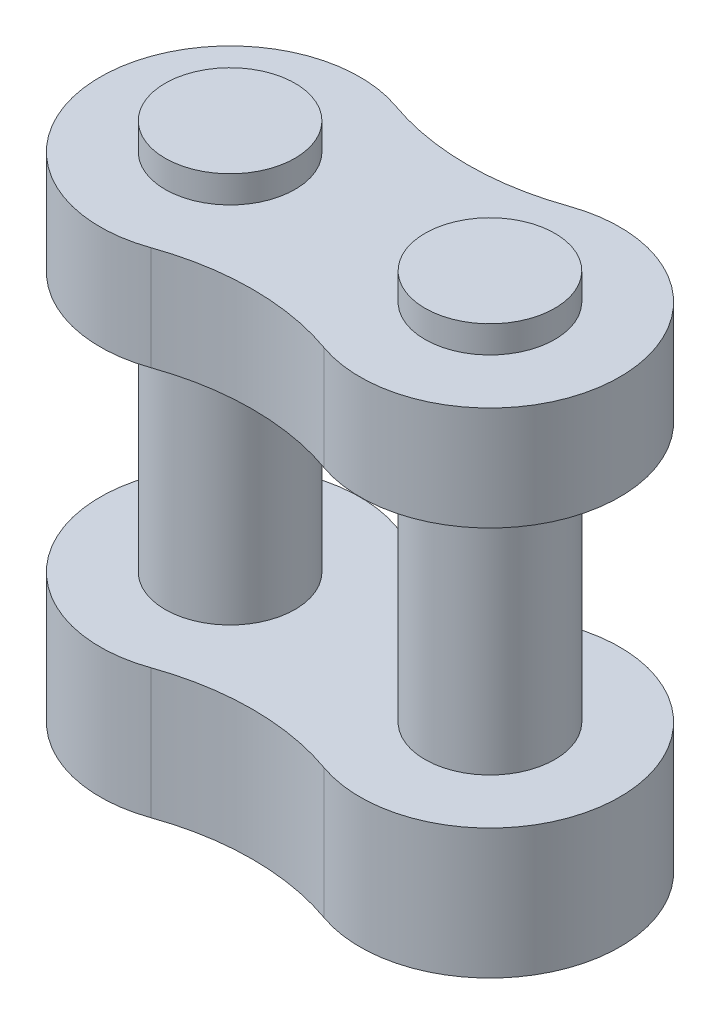
ISO-10303-21;
HEADER;
FILE_DESCRIPTION(('STEP AP214'),'2;1');
FILE_NAME('part.step','',(''),(''),'','','');
FILE_SCHEMA(('AUTOMOTIVE_DESIGN { 1 0 10303 214 1 1 1 1 }'));
ENDSEC;
DATA;
#1=APPLICATION_CONTEXT('core data for automotive mechanical design processes');
#2=APPLICATION_PROTOCOL_DEFINITION('international standard','automotive_design',2000,#1);
#3=PRODUCT_CONTEXT('',#1,'mechanical');
#4=PRODUCT('Part','Part','',(#3));
#5=PRODUCT_RELATED_PRODUCT_CATEGORY('part','',(#4));
#6=PRODUCT_DEFINITION_FORMATION('','',#4);
#7=PRODUCT_DEFINITION_CONTEXT('part definition',#1,'design');
#8=PRODUCT_DEFINITION('design','',#6,#7);
#9=PRODUCT_DEFINITION_SHAPE('','',#8);
#10=(LENGTH_UNIT() NAMED_UNIT(*) SI_UNIT(.MILLI.,.METRE.));
#11=(NAMED_UNIT(*) PLANE_ANGLE_UNIT() SI_UNIT($,.RADIAN.));
#12=(NAMED_UNIT(*) SI_UNIT($,.STERADIAN.) SOLID_ANGLE_UNIT());
#13=UNCERTAINTY_MEASURE_WITH_UNIT(LENGTH_MEASURE(1.E-05),#10,'distance_accuracy_value','');
#14=(GEOMETRIC_REPRESENTATION_CONTEXT(3) GLOBAL_UNCERTAINTY_ASSIGNED_CONTEXT((#13)) GLOBAL_UNIT_ASSIGNED_CONTEXT((#10,
#11,#12)) REPRESENTATION_CONTEXT('',''));
#15=CARTESIAN_POINT('',(0.,0.,0.));
#16=DIRECTION('',(0.,0.,1.));
#17=DIRECTION('',(1.,0.,0.));
#18=AXIS2_PLACEMENT_3D('',#15,#16,#17);
#19=CARTESIAN_POINT('',(-6.35,-9.525,0.));
#20=DIRECTION('',(0.,1.,0.));
#21=DIRECTION('',(0.,0.,1.));
#22=AXIS2_PLACEMENT_3D('',#19,#20,#21);
#23=CYLINDRICAL_SURFACE('',#22,3.175);
#24=CARTESIAN_POINT('',(-6.35,-6.35,0.));
#25=DIRECTION('',(0.,-1.,0.));
#26=DIRECTION('',(0.,0.,-1.));
#27=AXIS2_PLACEMENT_3D('',#24,#25,#26);
#28=CIRCLE('',#27,3.175);
#29=CARTESIAN_POINT('',(-5.29166666666667,-6.35,2.99341870702305));
#30=VERTEX_POINT('',#29);
#31=CARTESIAN_POINT('',(-5.29166666666667,-6.35,-2.99341870702305));
#32=VERTEX_POINT('',#31);
#33=EDGE_CURVE('E130',#30,#32,#28,.T.);
#34=ORIENTED_EDGE('',*,*,#33,.T.);
#35=DIRECTION('',(0.,1.,0.));
#36=VECTOR('',#35,1.);
#37=CARTESIAN_POINT('',(-5.29166666666667,-9.525,-2.99341870702305));
#38=LINE('',#37,#36);
#39=CARTESIAN_POINT('',(-5.29166666666667,-9.525,-2.99341870702305));
#40=VERTEX_POINT('',#39);
#41=EDGE_CURVE('E13',#40,#32,#38,.T.);
#42=ORIENTED_EDGE('',*,*,#41,.F.);
#43=CARTESIAN_POINT('',(-6.35,-9.525,0.));
#44=DIRECTION('',(0.,-1.,0.));
#45=DIRECTION('',(0.,0.,-1.));
#46=AXIS2_PLACEMENT_3D('',#43,#44,#45);
#47=CIRCLE('',#46,3.175);
#48=CARTESIAN_POINT('',(-5.29166666666667,-9.525,2.99341870702305));
#49=VERTEX_POINT('',#48);
#50=EDGE_CURVE('E116',#49,#40,#47,.T.);
#51=ORIENTED_EDGE('',*,*,#50,.F.);
#52=DIRECTION('',(0.,1.,0.));
#53=VECTOR('',#52,1.);
#54=CARTESIAN_POINT('',(-5.29166666666667,-9.525,2.99341870702305));
#55=LINE('',#54,#53);
#56=EDGE_CURVE('E83',#49,#30,#55,.T.);
#57=ORIENTED_EDGE('',*,*,#56,.T.);
#58=EDGE_LOOP('',(#34,#42,#51,#57));
#59=FACE_BOUND('',#58,.T.);
#60=ADVANCED_FACE('F67',(#59),#23,.T.);
#61=CARTESIAN_POINT('',(-3.175,-9.525,-8.98025612106924));
#62=DIRECTION('',(0.,1.,0.));
#63=DIRECTION('',(0.,0.,1.));
#64=AXIS2_PLACEMENT_3D('',#61,#62,#63);
#65=CYLINDRICAL_SURFACE('',#64,6.35000000000009);
#66=CARTESIAN_POINT('',(-3.175,-6.35,-8.98025612106924));
#67=DIRECTION('',(0.,1.,0.));
#68=DIRECTION('',(0.,0.,1.));
#69=AXIS2_PLACEMENT_3D('',#66,#67,#68);
#70=CIRCLE('',#69,6.35000000000009);
#71=CARTESIAN_POINT('',(-1.05833333333333,-6.35,-2.99341870702305));
#72=VERTEX_POINT('',#71);
#73=EDGE_CURVE('E121',#32,#72,#70,.T.);
#74=ORIENTED_EDGE('',*,*,#73,.T.);
#75=DIRECTION('',(0.,1.,0.));
#76=VECTOR('',#75,1.);
#77=CARTESIAN_POINT('',(-1.05833333333333,-9.525,-2.99341870702305));
#78=LINE('',#77,#76);
#79=CARTESIAN_POINT('',(-1.05833333333333,-9.525,-2.99341870702305));
#80=VERTEX_POINT('',#79);
#81=EDGE_CURVE('E75',#80,#72,#78,.T.);
#82=ORIENTED_EDGE('',*,*,#81,.F.);
#83=CARTESIAN_POINT('',(-3.175,-9.525,-8.98025612106924));
#84=DIRECTION('',(0.,1.,0.));
#85=DIRECTION('',(0.,0.,1.));
#86=AXIS2_PLACEMENT_3D('',#83,#84,#85);
#87=CIRCLE('',#86,6.35000000000009);
#88=EDGE_CURVE('E108',#40,#80,#87,.T.);
#89=ORIENTED_EDGE('',*,*,#88,.F.);
#90=ORIENTED_EDGE('',*,*,#41,.T.);
#91=EDGE_LOOP('',(#74,#82,#89,#90));
#92=FACE_BOUND('',#91,.T.);
#93=ADVANCED_FACE('F120',(#92),#65,.F.);
#94=CARTESIAN_POINT('',(0.,-9.525,0.));
#95=DIRECTION('',(0.,1.,0.));
#96=DIRECTION('',(0.,0.,1.));
#97=AXIS2_PLACEMENT_3D('',#94,#95,#96);
#98=CYLINDRICAL_SURFACE('',#97,3.175);
#99=CARTESIAN_POINT('',(0.,-6.35,0.));
#100=DIRECTION('',(0.,1.,0.));
#101=DIRECTION('',(0.,0.,1.));
#102=AXIS2_PLACEMENT_3D('',#99,#100,#101);
#103=CIRCLE('',#102,3.175);
#104=CARTESIAN_POINT('',(-1.05833333333334,-6.35,2.99341870702305));
#105=VERTEX_POINT('',#104);
#106=EDGE_CURVE('E133',#105,#72,#103,.T.);
#107=ORIENTED_EDGE('',*,*,#106,.F.);
#108=DIRECTION('',(0.,1.,0.));
#109=VECTOR('',#108,1.);
#110=CARTESIAN_POINT('',(-1.05833333333334,-9.525,2.99341870702305));
#111=LINE('',#110,#109);
#112=CARTESIAN_POINT('',(-1.05833333333334,-9.525,2.99341870702305));
#113=VERTEX_POINT('',#112);
#114=EDGE_CURVE('E97',#113,#105,#111,.T.);
#115=ORIENTED_EDGE('',*,*,#114,.F.);
#116=CARTESIAN_POINT('',(0.,-9.525,0.));
#117=DIRECTION('',(0.,1.,0.));
#118=DIRECTION('',(0.,0.,1.));
#119=AXIS2_PLACEMENT_3D('',#116,#117,#118);
#120=CIRCLE('',#119,3.175);
#121=EDGE_CURVE('E115',#113,#80,#120,.T.);
#122=ORIENTED_EDGE('',*,*,#121,.T.);
#123=ORIENTED_EDGE('',*,*,#81,.T.);
#124=EDGE_LOOP('',(#107,#115,#122,#123));
#125=FACE_BOUND('',#124,.T.);
#126=ADVANCED_FACE('F124',(#125),#98,.T.);
#127=CARTESIAN_POINT('',(-3.175,-9.525,8.98025612106918));
#128=DIRECTION('',(0.,1.,0.));
#129=DIRECTION('',(0.,0.,1.));
#130=AXIS2_PLACEMENT_3D('',#127,#128,#129);
#131=CYLINDRICAL_SURFACE('',#130,6.35000000000002);
#132=CARTESIAN_POINT('',(-3.175,-6.35,8.98025612106918));
#133=DIRECTION('',(0.,-1.,0.));
#134=DIRECTION('',(0.,0.,-1.));
#135=AXIS2_PLACEMENT_3D('',#132,#133,#134);
#136=CIRCLE('',#135,6.35000000000002);
#137=EDGE_CURVE('E135',#30,#105,#136,.T.);
#138=ORIENTED_EDGE('',*,*,#137,.F.);
#139=ORIENTED_EDGE('',*,*,#56,.F.);
#140=CARTESIAN_POINT('',(-3.175,-9.525,8.98025612106918));
#141=DIRECTION('',(0.,-1.,0.));
#142=DIRECTION('',(0.,0.,-1.));
#143=AXIS2_PLACEMENT_3D('',#140,#141,#142);
#144=CIRCLE('',#143,6.35000000000002);
#145=EDGE_CURVE('E125',#49,#113,#144,.T.);
#146=ORIENTED_EDGE('',*,*,#145,.T.);
#147=ORIENTED_EDGE('',*,*,#114,.T.);
#148=EDGE_LOOP('',(#138,#139,#146,#147));
#149=FACE_BOUND('',#148,.T.);
#150=ADVANCED_FACE('F141',(#149),#131,.F.);
#151=CARTESIAN_POINT('',(-4.7625,-9.525,-4.49012806053462));
#152=DIRECTION('',(0.,-1.,0.));
#153=DIRECTION('',(0.,0.,-1.));
#154=AXIS2_PLACEMENT_3D('',#151,#152,#153);
#155=PLANE('',#154);
#156=ORIENTED_EDGE('',*,*,#50,.T.);
#157=ORIENTED_EDGE('',*,*,#88,.T.);
#158=ORIENTED_EDGE('',*,*,#121,.F.);
#159=ORIENTED_EDGE('',*,*,#145,.F.);
#160=EDGE_LOOP('',(#156,#157,#158,#159));
#161=FACE_BOUND('',#160,.T.);
#162=ADVANCED_FACE('F112',(#161),#155,.T.);
#163=CARTESIAN_POINT('',(-4.7625,-6.35,-4.49012806053462));
#164=DIRECTION('',(0.,-1.,0.));
#165=DIRECTION('',(0.,0.,-1.));
#166=AXIS2_PLACEMENT_3D('',#163,#164,#165);
#167=PLANE('',#166);
#168=ORIENTED_EDGE('',*,*,#33,.F.);
#169=ORIENTED_EDGE('',*,*,#137,.T.);
#170=ORIENTED_EDGE('',*,*,#106,.T.);
#171=ORIENTED_EDGE('',*,*,#73,.F.);
#172=EDGE_LOOP('',(#168,#169,#170,#171));
#173=FACE_BOUND('',#172,.T.);
#174=ADVANCED_FACE('F140',(#173),#167,.F.);
#175=CLOSED_SHELL('',(#60,#93,#126,#150,#162,#174));
#176=MANIFOLD_SOLID_BREP('B2',#175);
#177=CARTESIAN_POINT('',(-6.35,2.54,0.));
#178=DIRECTION('',(0.,-1.,0.));
#179=DIRECTION('',(0.,0.,-1.));
#180=AXIS2_PLACEMENT_3D('',#177,#178,#179);
#181=CYLINDRICAL_SURFACE('',#180,3.175);
#182=CARTESIAN_POINT('',(-6.35,0.,0.));
#183=DIRECTION('',(0.,1.,0.));
#184=DIRECTION('',(0.,0.,1.));
#185=AXIS2_PLACEMENT_3D('',#182,#183,#184);
#186=CIRCLE('',#185,3.175);
#187=CARTESIAN_POINT('',(-5.29166666666667,0.,2.99341870702305));
#188=VERTEX_POINT('',#187);
#189=CARTESIAN_POINT('',(-5.29166666666667,0.,-2.99341870702305));
#190=VERTEX_POINT('',#189);
#191=EDGE_CURVE('E270',#188,#190,#186,.F.);
#192=ORIENTED_EDGE('',*,*,#191,.F.);
#193=DIRECTION('',(0.,-1.,0.));
#194=VECTOR('',#193,1.);
#195=CARTESIAN_POINT('',(-5.29166666666667,2.54,2.99341870702305));
#196=LINE('',#195,#194);
#197=CARTESIAN_POINT('',(-5.29166666666667,2.54,2.99341870702305));
#198=VERTEX_POINT('',#197);
#199=EDGE_CURVE('E65',#198,#188,#196,.T.);
#200=ORIENTED_EDGE('',*,*,#199,.F.);
#201=CARTESIAN_POINT('',(-6.35,2.54,0.));
#202=DIRECTION('',(0.,1.,0.));
#203=DIRECTION('',(0.,0.,1.));
#204=AXIS2_PLACEMENT_3D('',#201,#202,#203);
#205=CIRCLE('',#204,3.175);
#206=CARTESIAN_POINT('',(-5.29166666666667,2.54,-2.99341870702305));
#207=VERTEX_POINT('',#206);
#208=EDGE_CURVE('E247',#198,#207,#205,.F.);
#209=ORIENTED_EDGE('',*,*,#208,.T.);
#210=DIRECTION('',(0.,-1.,0.));
#211=VECTOR('',#210,1.);
#212=CARTESIAN_POINT('',(-5.29166666666667,2.54,-2.99341870702305));
#213=LINE('',#212,#211);
#214=EDGE_CURVE('E208',#207,#190,#213,.T.);
#215=ORIENTED_EDGE('',*,*,#214,.T.);
#216=EDGE_LOOP('',(#192,#200,#209,#215));
#217=FACE_BOUND('',#216,.T.);
#218=ADVANCED_FACE('F191',(#217),#181,.T.);
#219=CARTESIAN_POINT('',(-3.175,2.54,8.98025612106915));
#220=DIRECTION('',(0.,-1.,0.));
#221=DIRECTION('',(0.,0.,-1.));
#222=AXIS2_PLACEMENT_3D('',#219,#220,#221);
#223=CYLINDRICAL_SURFACE('',#222,6.35);
#224=CARTESIAN_POINT('',(-3.175,0.,8.98025612106915));
#225=DIRECTION('',(0.,1.,0.));
#226=DIRECTION('',(0.,0.,1.));
#227=AXIS2_PLACEMENT_3D('',#224,#225,#226);
#228=CIRCLE('',#227,6.35);
#229=CARTESIAN_POINT('',(-1.05833333333334,0.,2.99341870702305));
#230=VERTEX_POINT('',#229);
#231=EDGE_CURVE('E253',#188,#230,#228,.F.);
#232=ORIENTED_EDGE('',*,*,#231,.T.);
#233=DIRECTION('',(0.,-1.,0.));
#234=VECTOR('',#233,1.);
#235=CARTESIAN_POINT('',(-1.05833333333334,2.54,2.99341870702305));
#236=LINE('',#235,#234);
#237=CARTESIAN_POINT('',(-1.05833333333334,2.54,2.99341870702305));
#238=VERTEX_POINT('',#237);
#239=EDGE_CURVE('E200',#238,#230,#236,.T.);
#240=ORIENTED_EDGE('',*,*,#239,.F.);
#241=CARTESIAN_POINT('',(-3.175,2.54,8.98025612106915));
#242=DIRECTION('',(0.,1.,0.));
#243=DIRECTION('',(0.,0.,1.));
#244=AXIS2_PLACEMENT_3D('',#241,#242,#243);
#245=CIRCLE('',#244,6.35);
#246=EDGE_CURVE('E243',#198,#238,#245,.F.);
#247=ORIENTED_EDGE('',*,*,#246,.F.);
#248=ORIENTED_EDGE('',*,*,#199,.T.);
#249=EDGE_LOOP('',(#232,#240,#247,#248));
#250=FACE_BOUND('',#249,.T.);
#251=ADVANCED_FACE('F251',(#250),#223,.F.);
#252=CARTESIAN_POINT('',(0.,2.54,0.));
#253=DIRECTION('',(0.,-1.,0.));
#254=DIRECTION('',(0.,0.,-1.));
#255=AXIS2_PLACEMENT_3D('',#252,#253,#254);
#256=CYLINDRICAL_SURFACE('',#255,3.175);
#257=CARTESIAN_POINT('',(0.,0.,0.));
#258=DIRECTION('',(0.,1.,0.));
#259=DIRECTION('',(0.,0.,1.));
#260=AXIS2_PLACEMENT_3D('',#257,#258,#259);
#261=CIRCLE('',#260,3.175);
#262=CARTESIAN_POINT('',(-1.05833333333333,0.,-2.99341870702305));
#263=VERTEX_POINT('',#262);
#264=EDGE_CURVE('E265',#230,#263,#261,.T.);
#265=ORIENTED_EDGE('',*,*,#264,.T.);
#266=DIRECTION('',(0.,-1.,0.));
#267=VECTOR('',#266,1.);
#268=CARTESIAN_POINT('',(-1.05833333333333,2.54,-2.99341870702305));
#269=LINE('',#268,#267);
#270=CARTESIAN_POINT('',(-1.05833333333333,2.54,-2.99341870702305));
#271=VERTEX_POINT('',#270);
#272=EDGE_CURVE('E222',#271,#263,#269,.T.);
#273=ORIENTED_EDGE('',*,*,#272,.F.);
#274=CARTESIAN_POINT('',(0.,2.54,0.));
#275=DIRECTION('',(0.,1.,0.));
#276=DIRECTION('',(0.,0.,1.));
#277=AXIS2_PLACEMENT_3D('',#274,#275,#276);
#278=CIRCLE('',#277,3.175);
#279=EDGE_CURVE('E234',#238,#271,#278,.T.);
#280=ORIENTED_EDGE('',*,*,#279,.F.);
#281=ORIENTED_EDGE('',*,*,#239,.T.);
#282=EDGE_LOOP('',(#265,#273,#280,#281));
#283=FACE_BOUND('',#282,.T.);
#284=ADVANCED_FACE('F236',(#283),#256,.T.);
#285=CARTESIAN_POINT('',(-3.175,2.54,-8.98025612106915));
#286=DIRECTION('',(0.,-1.,0.));
#287=DIRECTION('',(0.,0.,-1.));
#288=AXIS2_PLACEMENT_3D('',#285,#286,#287);
#289=CYLINDRICAL_SURFACE('',#288,6.35);
#290=CARTESIAN_POINT('',(-3.175,0.,-8.98025612106915));
#291=DIRECTION('',(0.,1.,0.));
#292=DIRECTION('',(0.,0.,1.));
#293=AXIS2_PLACEMENT_3D('',#290,#291,#292);
#294=CIRCLE('',#293,6.35);
#295=EDGE_CURVE('E260',#190,#263,#294,.T.);
#296=ORIENTED_EDGE('',*,*,#295,.F.);
#297=ORIENTED_EDGE('',*,*,#214,.F.);
#298=CARTESIAN_POINT('',(-3.175,2.54,-8.98025612106915));
#299=DIRECTION('',(0.,1.,0.));
#300=DIRECTION('',(0.,0.,1.));
#301=AXIS2_PLACEMENT_3D('',#298,#299,#300);
#302=CIRCLE('',#301,6.35);
#303=EDGE_CURVE('E242',#207,#271,#302,.T.);
#304=ORIENTED_EDGE('',*,*,#303,.T.);
#305=ORIENTED_EDGE('',*,*,#272,.T.);
#306=EDGE_LOOP('',(#296,#297,#304,#305));
#307=FACE_BOUND('',#306,.T.);
#308=ADVANCED_FACE('F333',(#307),#289,.F.);
#309=CARTESIAN_POINT('',(0.,2.54,0.));
#310=DIRECTION('',(0.,1.,0.));
#311=DIRECTION('',(0.,0.,1.));
#312=AXIS2_PLACEMENT_3D('',#309,#310,#311);
#313=PLANE('',#312);
#314=CARTESIAN_POINT('',(-6.35,2.54,0.));
#315=DIRECTION('',(0.,1.,0.));
#316=DIRECTION('',(0.,0.,1.));
#317=AXIS2_PLACEMENT_3D('',#314,#315,#316);
#318=CIRCLE('',#317,1.5875);
#319=CARTESIAN_POINT('',(-6.35,2.54,1.5875));
#320=VERTEX_POINT('',#319);
#321=EDGE_CURVE('E264',#320,#320,#318,.T.);
#322=ORIENTED_EDGE('',*,*,#321,.F.);
#323=EDGE_LOOP('',(#322));
#324=FACE_BOUND('',#323,.T.);
#325=CARTESIAN_POINT('',(0.,2.54,0.));
#326=DIRECTION('',(0.,1.,0.));
#327=DIRECTION('',(0.,0.,1.));
#328=AXIS2_PLACEMENT_3D('',#325,#326,#327);
#329=CIRCLE('',#328,1.5875);
#330=CARTESIAN_POINT('',(0.,2.54,1.5875));
#331=VERTEX_POINT('',#330);
#332=EDGE_CURVE('E278',#331,#331,#329,.T.);
#333=ORIENTED_EDGE('',*,*,#332,.F.);
#334=EDGE_LOOP('',(#333));
#335=FACE_BOUND('',#334,.T.);
#336=ORIENTED_EDGE('',*,*,#208,.F.);
#337=ORIENTED_EDGE('',*,*,#246,.T.);
#338=ORIENTED_EDGE('',*,*,#279,.T.);
#339=ORIENTED_EDGE('',*,*,#303,.F.);
#340=EDGE_LOOP('',(#336,#337,#338,#339));
#341=FACE_BOUND('',#340,.T.);
#342=ADVANCED_FACE('F246',(#324,#335,#341),#313,.T.);
#343=CARTESIAN_POINT('',(0.,0.,0.));
#344=DIRECTION('',(0.,1.,0.));
#345=DIRECTION('',(0.,0.,1.));
#346=AXIS2_PLACEMENT_3D('',#343,#344,#345);
#347=PLANE('',#346);
#348=CARTESIAN_POINT('',(-6.35,0.,0.));
#349=DIRECTION('',(0.,1.,0.));
#350=DIRECTION('',(0.,0.,1.));
#351=AXIS2_PLACEMENT_3D('',#348,#349,#350);
#352=CIRCLE('',#351,1.5875);
#353=CARTESIAN_POINT('',(-6.35,0.,1.5875));
#354=VERTEX_POINT('',#353);
#355=EDGE_CURVE('E273',#354,#354,#352,.T.);
#356=ORIENTED_EDGE('',*,*,#355,.T.);
#357=EDGE_LOOP('',(#356));
#358=FACE_BOUND('',#357,.T.);
#359=CARTESIAN_POINT('',(0.,0.,0.));
#360=DIRECTION('',(0.,1.,0.));
#361=DIRECTION('',(0.,0.,1.));
#362=AXIS2_PLACEMENT_3D('',#359,#360,#361);
#363=CIRCLE('',#362,1.5875);
#364=CARTESIAN_POINT('',(0.,0.,1.5875));
#365=VERTEX_POINT('',#364);
#366=EDGE_CURVE('E296',#365,#365,#363,.T.);
#367=ORIENTED_EDGE('',*,*,#366,.T.);
#368=EDGE_LOOP('',(#367));
#369=FACE_BOUND('',#368,.T.);
#370=ORIENTED_EDGE('',*,*,#191,.T.);
#371=ORIENTED_EDGE('',*,*,#295,.T.);
#372=ORIENTED_EDGE('',*,*,#264,.F.);
#373=ORIENTED_EDGE('',*,*,#231,.F.);
#374=EDGE_LOOP('',(#370,#371,#372,#373));
#375=FACE_BOUND('',#374,.T.);
#376=ADVANCED_FACE('F332',(#358,#369,#375),#347,.F.);
#377=CARTESIAN_POINT('',(0.,-6.35,0.));
#378=DIRECTION('',(0.,1.,0.));
#379=DIRECTION('',(0.,0.,1.));
#380=AXIS2_PLACEMENT_3D('',#377,#378,#379);
#381=PLANE('',#380);
#382=CARTESIAN_POINT('',(-6.35,-6.35,0.));
#383=DIRECTION('',(0.,1.,0.));
#384=DIRECTION('',(0.,0.,1.));
#385=AXIS2_PLACEMENT_3D('',#382,#383,#384);
#386=CIRCLE('',#385,1.5875);
#387=CARTESIAN_POINT('',(-6.35,-6.35,1.5875));
#388=VERTEX_POINT('',#387);
#389=EDGE_CURVE('E288',#388,#388,#386,.T.);
#390=ORIENTED_EDGE('',*,*,#389,.F.);
#391=EDGE_LOOP('',(#390));
#392=FACE_BOUND('',#391,.T.);
#393=ADVANCED_FACE('F345',(#392),#381,.F.);
#394=CARTESIAN_POINT('',(-6.35,-6.35,0.));
#395=DIRECTION('',(0.,1.,0.));
#396=DIRECTION('',(0.,0.,1.));
#397=AXIS2_PLACEMENT_3D('',#394,#395,#396);
#398=CYLINDRICAL_SURFACE('',#397,1.5875);
#399=ORIENTED_EDGE('',*,*,#389,.T.);
#400=EDGE_LOOP('',(#399));
#401=FACE_BOUND('',#400,.T.);
#402=ORIENTED_EDGE('',*,*,#355,.F.);
#403=EDGE_LOOP('',(#402));
#404=FACE_BOUND('',#403,.T.);
#405=ADVANCED_FACE('F325',(#401,#404),#398,.T.);
#406=CARTESIAN_POINT('',(0.,3.2004,0.));
#407=DIRECTION('',(0.,1.,0.));
#408=DIRECTION('',(0.,0.,1.));
#409=AXIS2_PLACEMENT_3D('',#406,#407,#408);
#410=PLANE('',#409);
#411=CARTESIAN_POINT('',(-6.35,3.2004,0.));
#412=DIRECTION('',(0.,1.,0.));
#413=DIRECTION('',(0.,0.,1.));
#414=AXIS2_PLACEMENT_3D('',#411,#412,#413);
#415=CIRCLE('',#414,1.5875);
#416=CARTESIAN_POINT('',(-6.35,3.2004,1.5875));
#417=VERTEX_POINT('',#416);
#418=EDGE_CURVE('E292',#417,#417,#415,.T.);
#419=ORIENTED_EDGE('',*,*,#418,.T.);
#420=EDGE_LOOP('',(#419));
#421=FACE_BOUND('',#420,.T.);
#422=ADVANCED_FACE('F322',(#421),#410,.T.);
#423=ORIENTED_EDGE('',*,*,#321,.T.);
#424=EDGE_LOOP('',(#423));
#425=FACE_BOUND('',#424,.T.);
#426=ORIENTED_EDGE('',*,*,#418,.F.);
#427=EDGE_LOOP('',(#426));
#428=FACE_BOUND('',#427,.T.);
#429=ADVANCED_FACE('F314',(#425,#428),#398,.T.);
#430=CARTESIAN_POINT('',(0.,-6.35,0.));
#431=DIRECTION('',(0.,1.,0.));
#432=DIRECTION('',(0.,0.,1.));
#433=AXIS2_PLACEMENT_3D('',#430,#431,#432);
#434=PLANE('',#433);
#435=CARTESIAN_POINT('',(0.,-6.35,0.));
#436=DIRECTION('',(0.,1.,0.));
#437=DIRECTION('',(0.,0.,1.));
#438=AXIS2_PLACEMENT_3D('',#435,#436,#437);
#439=CIRCLE('',#438,1.5875);
#440=CARTESIAN_POINT('',(0.,-6.35,1.5875));
#441=VERTEX_POINT('',#440);
#442=EDGE_CURVE('E304',#441,#441,#439,.T.);
#443=ORIENTED_EDGE('',*,*,#442,.F.);
#444=EDGE_LOOP('',(#443));
#445=FACE_BOUND('',#444,.T.);
#446=ADVANCED_FACE('F312',(#445),#434,.F.);
#447=CARTESIAN_POINT('',(0.,-6.35,0.));
#448=DIRECTION('',(0.,1.,0.));
#449=DIRECTION('',(0.,0.,1.));
#450=AXIS2_PLACEMENT_3D('',#447,#448,#449);
#451=CYLINDRICAL_SURFACE('',#450,1.5875);
#452=ORIENTED_EDGE('',*,*,#442,.T.);
#453=EDGE_LOOP('',(#452));
#454=FACE_BOUND('',#453,.T.);
#455=ORIENTED_EDGE('',*,*,#366,.F.);
#456=EDGE_LOOP('',(#455));
#457=FACE_BOUND('',#456,.T.);
#458=ADVANCED_FACE('F309',(#454,#457),#451,.T.);
#459=ORIENTED_EDGE('',*,*,#332,.T.);
#460=EDGE_LOOP('',(#459));
#461=FACE_BOUND('',#460,.T.);
#462=CARTESIAN_POINT('',(0.,3.2004,0.));
#463=DIRECTION('',(0.,1.,0.));
#464=DIRECTION('',(0.,0.,1.));
#465=AXIS2_PLACEMENT_3D('',#462,#463,#464);
#466=CIRCLE('',#465,1.5875);
#467=CARTESIAN_POINT('',(0.,3.2004,1.5875));
#468=VERTEX_POINT('',#467);
#469=EDGE_CURVE('E300',#468,#468,#466,.T.);
#470=ORIENTED_EDGE('',*,*,#469,.F.);
#471=EDGE_LOOP('',(#470));
#472=FACE_BOUND('',#471,.T.);
#473=ADVANCED_FACE('F320',(#461,#472),#451,.T.);
#474=CARTESIAN_POINT('',(0.,3.2004,0.));
#475=DIRECTION('',(0.,1.,0.));
#476=DIRECTION('',(0.,0.,1.));
#477=AXIS2_PLACEMENT_3D('',#474,#475,#476);
#478=PLANE('',#477);
#479=ORIENTED_EDGE('',*,*,#469,.T.);
#480=EDGE_LOOP('',(#479));
#481=FACE_BOUND('',#480,.T.);
#482=ADVANCED_FACE('F353',(#481),#478,.T.);
#483=CLOSED_SHELL('',(#218,#251,#284,#308,#342,#376,#393,#405,#422,#429,#446,#458,#473,#482));
#484=MANIFOLD_SOLID_BREP('B7',#483);
#485=ADVANCED_BREP_SHAPE_REPRESENTATION('',(#18,#176,#484),#14);
#486=SHAPE_DEFINITION_REPRESENTATION(#9,#485);
ENDSEC;
END-ISO-10303-21;
